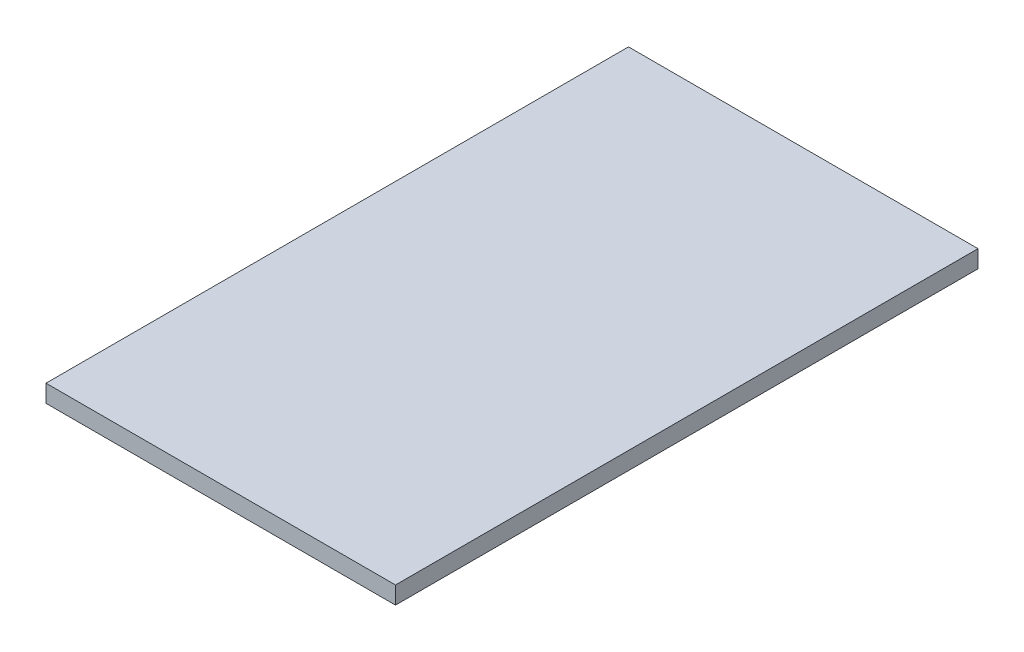
ISO-10303-21;
HEADER;
FILE_DESCRIPTION(('STEP AP214'),'2;1');
FILE_NAME('part.step','',(''),(''),'','','');
FILE_SCHEMA(('AUTOMOTIVE_DESIGN { 1 0 10303 214 1 1 1 1 }'));
ENDSEC;
DATA;
#1=APPLICATION_CONTEXT('core data for automotive mechanical design processes');
#2=APPLICATION_PROTOCOL_DEFINITION('international standard','automotive_design',2000,#1);
#3=PRODUCT_CONTEXT('',#1,'mechanical');
#4=PRODUCT('Part','Part','',(#3));
#5=PRODUCT_RELATED_PRODUCT_CATEGORY('part','',(#4));
#6=PRODUCT_DEFINITION_FORMATION('','',#4);
#7=PRODUCT_DEFINITION_CONTEXT('part definition',#1,'design');
#8=PRODUCT_DEFINITION('design','',#6,#7);
#9=PRODUCT_DEFINITION_SHAPE('','',#8);
#10=(LENGTH_UNIT() NAMED_UNIT(*) SI_UNIT(.MILLI.,.METRE.));
#11=(NAMED_UNIT(*) PLANE_ANGLE_UNIT() SI_UNIT($,.RADIAN.));
#12=(NAMED_UNIT(*) SI_UNIT($,.STERADIAN.) SOLID_ANGLE_UNIT());
#13=UNCERTAINTY_MEASURE_WITH_UNIT(LENGTH_MEASURE(1.E-05),#10,'distance_accuracy_value','');
#14=(GEOMETRIC_REPRESENTATION_CONTEXT(3) GLOBAL_UNCERTAINTY_ASSIGNED_CONTEXT((#13)) GLOBAL_UNIT_ASSIGNED_CONTEXT((#10,
#11,#12)) REPRESENTATION_CONTEXT('',''));
#15=CARTESIAN_POINT('',(0.,0.,0.));
#16=DIRECTION('',(0.,0.,1.));
#17=DIRECTION('',(1.,0.,0.));
#18=AXIS2_PLACEMENT_3D('',#15,#16,#17);
#19=CARTESIAN_POINT('',(300.,30.,-500.));
#20=DIRECTION('',(-1.,0.,0.));
#21=DIRECTION('',(0.,0.,1.));
#22=AXIS2_PLACEMENT_3D('',#19,#20,#21);
#23=PLANE('',#22);
#24=DIRECTION('',(0.,0.,-1.));
#25=VECTOR('',#24,1.);
#26=CARTESIAN_POINT('',(300.,0.,-500.));
#27=LINE('',#26,#25);
#28=CARTESIAN_POINT('',(300.,0.,500.));
#29=VERTEX_POINT('',#28);
#30=CARTESIAN_POINT('',(300.,0.,-500.));
#31=VERTEX_POINT('',#30);
#32=EDGE_CURVE('E103',#29,#31,#27,.T.);
#33=ORIENTED_EDGE('',*,*,#32,.T.);
#34=DIRECTION('',(0.,-1.,0.));
#35=VECTOR('',#34,1.);
#36=CARTESIAN_POINT('',(300.,30.,-500.));
#37=LINE('',#36,#35);
#38=CARTESIAN_POINT('',(300.,30.,-500.));
#39=VERTEX_POINT('',#38);
#40=EDGE_CURVE('E11',#39,#31,#37,.T.);
#41=ORIENTED_EDGE('',*,*,#40,.F.);
#42=DIRECTION('',(0.,0.,-1.));
#43=VECTOR('',#42,1.);
#44=CARTESIAN_POINT('',(300.,30.,-500.));
#45=LINE('',#44,#43);
#46=CARTESIAN_POINT('',(300.,30.,500.));
#47=VERTEX_POINT('',#46);
#48=EDGE_CURVE('E91',#47,#39,#45,.T.);
#49=ORIENTED_EDGE('',*,*,#48,.F.);
#50=DIRECTION('',(0.,-1.,0.));
#51=VECTOR('',#50,1.);
#52=CARTESIAN_POINT('',(300.,30.,500.));
#53=LINE('',#52,#51);
#54=EDGE_CURVE('E99',#47,#29,#53,.T.);
#55=ORIENTED_EDGE('',*,*,#54,.T.);
#56=EDGE_LOOP('',(#33,#41,#49,#55));
#57=FACE_BOUND('',#56,.T.);
#58=ADVANCED_FACE('F40',(#57),#23,.F.);
#59=CARTESIAN_POINT('',(-300.,30.,-500.));
#60=DIRECTION('',(0.,0.,1.));
#61=DIRECTION('',(1.,0.,0.));
#62=AXIS2_PLACEMENT_3D('',#59,#60,#61);
#63=PLANE('',#62);
#64=DIRECTION('',(-1.,0.,0.));
#65=VECTOR('',#64,1.);
#66=CARTESIAN_POINT('',(-300.,0.,-500.));
#67=LINE('',#66,#65);
#68=CARTESIAN_POINT('',(-300.,0.,-500.));
#69=VERTEX_POINT('',#68);
#70=EDGE_CURVE('E95',#31,#69,#67,.T.);
#71=ORIENTED_EDGE('',*,*,#70,.T.);
#72=DIRECTION('',(0.,-1.,0.));
#73=VECTOR('',#72,1.);
#74=CARTESIAN_POINT('',(-300.,30.,-500.));
#75=LINE('',#74,#73);
#76=CARTESIAN_POINT('',(-300.,30.,-500.));
#77=VERTEX_POINT('',#76);
#78=EDGE_CURVE('E48',#77,#69,#75,.T.);
#79=ORIENTED_EDGE('',*,*,#78,.F.);
#80=DIRECTION('',(-1.,0.,0.));
#81=VECTOR('',#80,1.);
#82=CARTESIAN_POINT('',(-300.,30.,-500.));
#83=LINE('',#82,#81);
#84=EDGE_CURVE('E86',#39,#77,#83,.T.);
#85=ORIENTED_EDGE('',*,*,#84,.F.);
#86=ORIENTED_EDGE('',*,*,#40,.T.);
#87=EDGE_LOOP('',(#71,#79,#85,#86));
#88=FACE_BOUND('',#87,.T.);
#89=ADVANCED_FACE('F94',(#88),#63,.F.);
#90=CARTESIAN_POINT('',(-300.,30.,-500.));
#91=DIRECTION('',(1.,0.,0.));
#92=DIRECTION('',(0.,0.,-1.));
#93=AXIS2_PLACEMENT_3D('',#90,#91,#92);
#94=PLANE('',#93);
#95=DIRECTION('',(0.,0.,1.));
#96=VECTOR('',#95,1.);
#97=CARTESIAN_POINT('',(-300.,0.,-500.));
#98=LINE('',#97,#96);
#99=CARTESIAN_POINT('',(-300.,0.,500.));
#100=VERTEX_POINT('',#99);
#101=EDGE_CURVE('E73',#69,#100,#98,.T.);
#102=ORIENTED_EDGE('',*,*,#101,.T.);
#103=DIRECTION('',(0.,-1.,0.));
#104=VECTOR('',#103,1.);
#105=CARTESIAN_POINT('',(-300.,30.,500.));
#106=LINE('',#105,#104);
#107=CARTESIAN_POINT('',(-300.,30.,500.));
#108=VERTEX_POINT('',#107);
#109=EDGE_CURVE('E96',#108,#100,#106,.T.);
#110=ORIENTED_EDGE('',*,*,#109,.F.);
#111=DIRECTION('',(0.,0.,1.));
#112=VECTOR('',#111,1.);
#113=CARTESIAN_POINT('',(-300.,30.,-500.));
#114=LINE('',#113,#112);
#115=EDGE_CURVE('E89',#77,#108,#114,.T.);
#116=ORIENTED_EDGE('',*,*,#115,.F.);
#117=ORIENTED_EDGE('',*,*,#78,.T.);
#118=EDGE_LOOP('',(#102,#110,#116,#117));
#119=FACE_BOUND('',#118,.T.);
#120=ADVANCED_FACE('F97',(#119),#94,.F.);
#121=CARTESIAN_POINT('',(-300.,30.,500.));
#122=DIRECTION('',(0.,0.,-1.));
#123=DIRECTION('',(-1.,0.,0.));
#124=AXIS2_PLACEMENT_3D('',#121,#122,#123);
#125=PLANE('',#124);
#126=DIRECTION('',(1.,0.,0.));
#127=VECTOR('',#126,1.);
#128=CARTESIAN_POINT('',(-300.,0.,500.));
#129=LINE('',#128,#127);
#130=EDGE_CURVE('E79',#100,#29,#129,.T.);
#131=ORIENTED_EDGE('',*,*,#130,.T.);
#132=ORIENTED_EDGE('',*,*,#54,.F.);
#133=DIRECTION('',(1.,0.,0.));
#134=VECTOR('',#133,1.);
#135=CARTESIAN_POINT('',(-300.,30.,500.));
#136=LINE('',#135,#134);
#137=EDGE_CURVE('E56',#108,#47,#136,.T.);
#138=ORIENTED_EDGE('',*,*,#137,.F.);
#139=ORIENTED_EDGE('',*,*,#109,.T.);
#140=EDGE_LOOP('',(#131,#132,#138,#139));
#141=FACE_BOUND('',#140,.T.);
#142=ADVANCED_FACE('F110',(#141),#125,.F.);
#143=CARTESIAN_POINT('',(0.,30.,0.));
#144=DIRECTION('',(0.,1.,0.));
#145=DIRECTION('',(0.,0.,1.));
#146=AXIS2_PLACEMENT_3D('',#143,#144,#145);
#147=PLANE('',#146);
#148=ORIENTED_EDGE('',*,*,#48,.T.);
#149=ORIENTED_EDGE('',*,*,#84,.T.);
#150=ORIENTED_EDGE('',*,*,#115,.T.);
#151=ORIENTED_EDGE('',*,*,#137,.T.);
#152=EDGE_LOOP('',(#148,#149,#150,#151));
#153=FACE_BOUND('',#152,.T.);
#154=ADVANCED_FACE('F87',(#153),#147,.T.);
#155=CARTESIAN_POINT('',(0.,0.,0.));
#156=DIRECTION('',(0.,1.,0.));
#157=DIRECTION('',(0.,0.,1.));
#158=AXIS2_PLACEMENT_3D('',#155,#156,#157);
#159=PLANE('',#158);
#160=ORIENTED_EDGE('',*,*,#32,.F.);
#161=ORIENTED_EDGE('',*,*,#130,.F.);
#162=ORIENTED_EDGE('',*,*,#101,.F.);
#163=ORIENTED_EDGE('',*,*,#70,.F.);
#164=EDGE_LOOP('',(#160,#161,#162,#163));
#165=FACE_BOUND('',#164,.T.);
#166=ADVANCED_FACE('F113',(#165),#159,.F.);
#167=CLOSED_SHELL('',(#58,#89,#120,#142,#154,#166));
#168=MANIFOLD_SOLID_BREP('B2',#167);
#169=ADVANCED_BREP_SHAPE_REPRESENTATION('',(#18,#168),#14);
#170=SHAPE_DEFINITION_REPRESENTATION(#9,#169);
ENDSEC;
END-ISO-10303-21;
